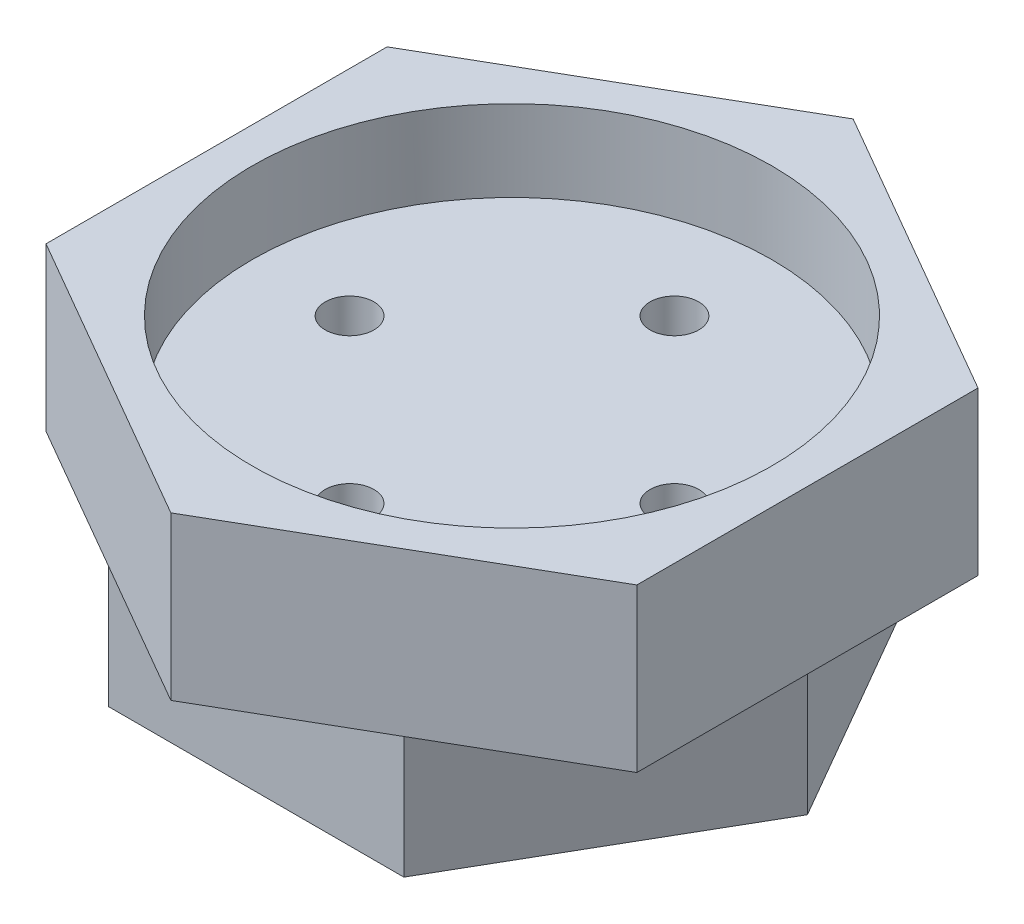
ISO-10303-21;
HEADER;
FILE_DESCRIPTION(('STEP AP214'),'2;1');
FILE_NAME('part.step','',(''),(''),'','','');
FILE_SCHEMA(('AUTOMOTIVE_DESIGN { 1 0 10303 214 1 1 1 1 }'));
ENDSEC;
DATA;
#1=APPLICATION_CONTEXT('core data for automotive mechanical design processes');
#2=APPLICATION_PROTOCOL_DEFINITION('international standard','automotive_design',2000,#1);
#3=PRODUCT_CONTEXT('',#1,'mechanical');
#4=PRODUCT('Part','Part','',(#3));
#5=PRODUCT_RELATED_PRODUCT_CATEGORY('part','',(#4));
#6=PRODUCT_DEFINITION_FORMATION('','',#4);
#7=PRODUCT_DEFINITION_CONTEXT('part definition',#1,'design');
#8=PRODUCT_DEFINITION('design','',#6,#7);
#9=PRODUCT_DEFINITION_SHAPE('','',#8);
#10=(LENGTH_UNIT() NAMED_UNIT(*) SI_UNIT(.MILLI.,.METRE.));
#11=(NAMED_UNIT(*) PLANE_ANGLE_UNIT() SI_UNIT($,.RADIAN.));
#12=(NAMED_UNIT(*) SI_UNIT($,.STERADIAN.) SOLID_ANGLE_UNIT());
#13=UNCERTAINTY_MEASURE_WITH_UNIT(LENGTH_MEASURE(1.E-05),#10,'distance_accuracy_value','');
#14=(GEOMETRIC_REPRESENTATION_CONTEXT(3) GLOBAL_UNCERTAINTY_ASSIGNED_CONTEXT((#13)) GLOBAL_UNIT_ASSIGNED_CONTEXT((#10,
#11,#12)) REPRESENTATION_CONTEXT('',''));
#15=CARTESIAN_POINT('',(0.,0.,0.));
#16=DIRECTION('',(0.,0.,1.));
#17=DIRECTION('',(1.,0.,0.));
#18=AXIS2_PLACEMENT_3D('',#15,#16,#17);
#19=CARTESIAN_POINT('',(0.,0.,0.));
#20=DIRECTION('',(0.,1.,0.));
#21=DIRECTION('',(0.,0.,1.));
#22=AXIS2_PLACEMENT_3D('',#19,#20,#21);
#23=PLANE('',#22);
#24=DIRECTION('',(0.5,0.,0.866025403784439));
#25=VECTOR('',#24,1.);
#26=CARTESIAN_POINT('',(18.1865334794732,0.,-31.5));
#27=LINE('',#26,#25);
#28=CARTESIAN_POINT('',(18.1865334794732,0.,-31.5));
#29=VERTEX_POINT('',#28);
#30=CARTESIAN_POINT('',(36.3730669589464,0.,0.));
#31=VERTEX_POINT('',#30);
#32=EDGE_CURVE('E159',#29,#31,#27,.T.);
#33=ORIENTED_EDGE('',*,*,#32,.F.);
#34=DIRECTION('',(0.866025403784439,0.,0.5));
#35=VECTOR('',#34,1.);
#36=CARTESIAN_POINT('',(0.,0.,-42.));
#37=LINE('',#36,#35);
#38=CARTESIAN_POINT('',(36.3730669589464,0.,-21.));
#39=VERTEX_POINT('',#38);
#40=EDGE_CURVE('E160',#29,#39,#37,.T.);
#41=ORIENTED_EDGE('',*,*,#40,.T.);
#42=DIRECTION('',(0.,0.,1.));
#43=VECTOR('',#42,1.);
#44=CARTESIAN_POINT('',(36.3730669589464,0.,-21.));
#45=LINE('',#44,#43);
#46=EDGE_CURVE('E188',#39,#31,#45,.T.);
#47=ORIENTED_EDGE('',*,*,#46,.T.);
#48=EDGE_LOOP('',(#33,#41,#47));
#49=FACE_BOUND('',#48,.T.);
#50=ADVANCED_FACE('F46',(#49),#23,.F.);
#51=DIRECTION('',(1.,0.,0.));
#52=VECTOR('',#51,1.);
#53=CARTESIAN_POINT('',(-18.1865334794732,0.,-31.5));
#54=LINE('',#53,#52);
#55=CARTESIAN_POINT('',(-18.1865334794731,0.,-31.5));
#56=VERTEX_POINT('',#55);
#57=EDGE_CURVE('E60',#56,#29,#54,.T.);
#58=ORIENTED_EDGE('',*,*,#57,.F.);
#59=DIRECTION('',(0.866025403784439,0.,-0.5));
#60=VECTOR('',#59,1.);
#61=CARTESIAN_POINT('',(-36.3730669589464,0.,-21.));
#62=LINE('',#61,#60);
#63=CARTESIAN_POINT('',(0.,0.,-42.));
#64=VERTEX_POINT('',#63);
#65=EDGE_CURVE('E202',#56,#64,#62,.T.);
#66=ORIENTED_EDGE('',*,*,#65,.T.);
#67=EDGE_CURVE('E162',#64,#29,#37,.T.);
#68=ORIENTED_EDGE('',*,*,#67,.T.);
#69=EDGE_LOOP('',(#58,#66,#68));
#70=FACE_BOUND('',#69,.T.);
#71=ADVANCED_FACE('F244',(#70),#23,.F.);
#72=DIRECTION('',(0.5,0.,-0.866025403784439));
#73=VECTOR('',#72,1.);
#74=CARTESIAN_POINT('',(-36.3730669589464,0.,0.));
#75=LINE('',#74,#73);
#76=CARTESIAN_POINT('',(-36.3730669589464,0.,0.));
#77=VERTEX_POINT('',#76);
#78=EDGE_CURVE('E68',#77,#56,#75,.T.);
#79=ORIENTED_EDGE('',*,*,#78,.F.);
#80=DIRECTION('',(0.,0.,-1.));
#81=VECTOR('',#80,1.);
#82=CARTESIAN_POINT('',(-36.3730669589464,0.,21.));
#83=LINE('',#82,#81);
#84=CARTESIAN_POINT('',(-36.3730669589464,0.,-21.));
#85=VERTEX_POINT('',#84);
#86=EDGE_CURVE('E198',#77,#85,#83,.T.);
#87=ORIENTED_EDGE('',*,*,#86,.T.);
#88=EDGE_CURVE('E171',#85,#56,#62,.T.);
#89=ORIENTED_EDGE('',*,*,#88,.T.);
#90=EDGE_LOOP('',(#79,#87,#89));
#91=FACE_BOUND('',#90,.T.);
#92=ADVANCED_FACE('F250',(#91),#23,.F.);
#93=DIRECTION('',(-0.5,0.,-0.866025403784438));
#94=VECTOR('',#93,1.);
#95=CARTESIAN_POINT('',(-18.1865334794732,0.,31.5));
#96=LINE('',#95,#94);
#97=CARTESIAN_POINT('',(-18.1865334794733,0.,31.5));
#98=VERTEX_POINT('',#97);
#99=EDGE_CURVE('E285',#98,#77,#96,.T.);
#100=ORIENTED_EDGE('',*,*,#99,.F.);
#101=DIRECTION('',(-0.866025403784439,0.,-0.5));
#102=VECTOR('',#101,1.);
#103=CARTESIAN_POINT('',(0.,0.,42.));
#104=LINE('',#103,#102);
#105=CARTESIAN_POINT('',(-36.3730669589464,0.,21.));
#106=VERTEX_POINT('',#105);
#107=EDGE_CURVE('E194',#98,#106,#104,.T.);
#108=ORIENTED_EDGE('',*,*,#107,.T.);
#109=EDGE_CURVE('E199',#106,#77,#83,.T.);
#110=ORIENTED_EDGE('',*,*,#109,.T.);
#111=EDGE_LOOP('',(#100,#108,#110));
#112=FACE_BOUND('',#111,.T.);
#113=ADVANCED_FACE('F257',(#112),#23,.F.);
#114=DIRECTION('',(-1.,0.,0.));
#115=VECTOR('',#114,1.);
#116=CARTESIAN_POINT('',(18.1865334794732,0.,31.5));
#117=LINE('',#116,#115);
#118=CARTESIAN_POINT('',(18.1865334794732,0.,31.5));
#119=VERTEX_POINT('',#118);
#120=EDGE_CURVE('E263',#119,#98,#117,.T.);
#121=ORIENTED_EDGE('',*,*,#120,.F.);
#122=DIRECTION('',(-0.866025403784439,0.,0.5));
#123=VECTOR('',#122,1.);
#124=CARTESIAN_POINT('',(36.3730669589464,0.,21.));
#125=LINE('',#124,#123);
#126=CARTESIAN_POINT('',(0.,0.,42.));
#127=VERTEX_POINT('',#126);
#128=EDGE_CURVE('E191',#119,#127,#125,.T.);
#129=ORIENTED_EDGE('',*,*,#128,.T.);
#130=EDGE_CURVE('E195',#127,#98,#104,.T.);
#131=ORIENTED_EDGE('',*,*,#130,.T.);
#132=EDGE_LOOP('',(#121,#129,#131));
#133=FACE_BOUND('',#132,.T.);
#134=ADVANCED_FACE('F252',(#133),#23,.F.);
#135=DIRECTION('',(-0.5,0.,0.866025403784439));
#136=VECTOR('',#135,1.);
#137=CARTESIAN_POINT('',(36.3730669589464,0.,0.));
#138=LINE('',#137,#136);
#139=EDGE_CURVE('E259',#31,#119,#138,.T.);
#140=ORIENTED_EDGE('',*,*,#139,.F.);
#141=CARTESIAN_POINT('',(36.3730669589464,0.,21.));
#142=VERTEX_POINT('',#141);
#143=EDGE_CURVE('E187',#31,#142,#45,.T.);
#144=ORIENTED_EDGE('',*,*,#143,.T.);
#145=EDGE_CURVE('E192',#142,#119,#125,.T.);
#146=ORIENTED_EDGE('',*,*,#145,.T.);
#147=EDGE_LOOP('',(#140,#144,#146));
#148=FACE_BOUND('',#147,.T.);
#149=ADVANCED_FACE('F246',(#148),#23,.F.);
#150=CARTESIAN_POINT('',(0.,20.,0.));
#151=DIRECTION('',(0.,-1.,0.));
#152=DIRECTION('',(0.,0.,-1.));
#153=AXIS2_PLACEMENT_3D('',#150,#151,#152);
#154=PLANE('',#153);
#155=CARTESIAN_POINT('',(0.,20.,0.));
#156=DIRECTION('',(0.,-1.,0.));
#157=DIRECTION('',(0.,0.,-1.));
#158=AXIS2_PLACEMENT_3D('',#155,#156,#157);
#159=CIRCLE('',#158,32.);
#160=CARTESIAN_POINT('',(0.,20.,-32.));
#161=VERTEX_POINT('',#160);
#162=EDGE_CURVE('E53',#161,#161,#159,.T.);
#163=ORIENTED_EDGE('',*,*,#162,.T.);
#164=EDGE_LOOP('',(#163));
#165=FACE_BOUND('',#164,.T.);
#166=DIRECTION('',(0.866025403784439,0.,0.5));
#167=VECTOR('',#166,1.);
#168=CARTESIAN_POINT('',(0.,20.,-42.));
#169=LINE('',#168,#167);
#170=CARTESIAN_POINT('',(0.,20.,-42.));
#171=VERTEX_POINT('',#170);
#172=CARTESIAN_POINT('',(36.3730669589464,20.,-21.));
#173=VERTEX_POINT('',#172);
#174=EDGE_CURVE('E168',#171,#173,#169,.T.);
#175=ORIENTED_EDGE('',*,*,#174,.F.);
#176=DIRECTION('',(0.866025403784439,0.,-0.5));
#177=VECTOR('',#176,1.);
#178=CARTESIAN_POINT('',(-36.3730669589464,20.,-21.));
#179=LINE('',#178,#177);
#180=CARTESIAN_POINT('',(-36.3730669589464,20.,-21.));
#181=VERTEX_POINT('',#180);
#182=EDGE_CURVE('E183',#181,#171,#179,.T.);
#183=ORIENTED_EDGE('',*,*,#182,.F.);
#184=DIRECTION('',(0.,0.,-1.));
#185=VECTOR('',#184,1.);
#186=CARTESIAN_POINT('',(-36.3730669589464,20.,21.));
#187=LINE('',#186,#185);
#188=CARTESIAN_POINT('',(-36.3730669589464,20.,21.));
#189=VERTEX_POINT('',#188);
#190=EDGE_CURVE('E180',#189,#181,#187,.T.);
#191=ORIENTED_EDGE('',*,*,#190,.F.);
#192=DIRECTION('',(-0.866025403784439,0.,-0.5));
#193=VECTOR('',#192,1.);
#194=CARTESIAN_POINT('',(0.,20.,42.));
#195=LINE('',#194,#193);
#196=CARTESIAN_POINT('',(0.,20.,42.));
#197=VERTEX_POINT('',#196);
#198=EDGE_CURVE('E177',#197,#189,#195,.T.);
#199=ORIENTED_EDGE('',*,*,#198,.F.);
#200=DIRECTION('',(-0.866025403784439,0.,0.5));
#201=VECTOR('',#200,1.);
#202=CARTESIAN_POINT('',(36.3730669589464,20.,21.));
#203=LINE('',#202,#201);
#204=CARTESIAN_POINT('',(36.3730669589464,20.,21.));
#205=VERTEX_POINT('',#204);
#206=EDGE_CURVE('E174',#205,#197,#203,.T.);
#207=ORIENTED_EDGE('',*,*,#206,.F.);
#208=DIRECTION('',(0.,0.,1.));
#209=VECTOR('',#208,1.);
#210=CARTESIAN_POINT('',(36.3730669589464,20.,-21.));
#211=LINE('',#210,#209);
#212=EDGE_CURVE('E170',#173,#205,#211,.T.);
#213=ORIENTED_EDGE('',*,*,#212,.F.);
#214=EDGE_LOOP('',(#175,#183,#191,#199,#207,#213));
#215=FACE_BOUND('',#214,.T.);
#216=ADVANCED_FACE('F223',(#165,#215),#154,.F.);
#217=CARTESIAN_POINT('',(0.,10.,0.));
#218=DIRECTION('',(0.,1.,0.));
#219=DIRECTION('',(0.,0.,1.));
#220=AXIS2_PLACEMENT_3D('',#217,#218,#219);
#221=PLANE('',#220);
#222=CARTESIAN_POINT('',(0.,10.,20.));
#223=DIRECTION('',(0.,1.,0.));
#224=DIRECTION('',(0.,0.,1.));
#225=AXIS2_PLACEMENT_3D('',#222,#223,#224);
#226=CIRCLE('',#225,3.);
#227=CARTESIAN_POINT('',(0.,10.,23.));
#228=VERTEX_POINT('',#227);
#229=EDGE_CURVE('E311',#228,#228,#226,.T.);
#230=ORIENTED_EDGE('',*,*,#229,.F.);
#231=EDGE_LOOP('',(#230));
#232=FACE_BOUND('',#231,.T.);
#233=CARTESIAN_POINT('',(20.,10.,0.));
#234=DIRECTION('',(0.,1.,0.));
#235=DIRECTION('',(0.,0.,1.));
#236=AXIS2_PLACEMENT_3D('',#233,#234,#235);
#237=CIRCLE('',#236,3.);
#238=CARTESIAN_POINT('',(20.,10.,2.99999999999993));
#239=VERTEX_POINT('',#238);
#240=EDGE_CURVE('E313',#239,#239,#237,.T.);
#241=ORIENTED_EDGE('',*,*,#240,.F.);
#242=EDGE_LOOP('',(#241));
#243=FACE_BOUND('',#242,.T.);
#244=CARTESIAN_POINT('',(-1.39659253553725E-13,10.,-20.));
#245=DIRECTION('',(0.,1.,0.));
#246=DIRECTION('',(0.,0.,1.));
#247=AXIS2_PLACEMENT_3D('',#244,#245,#246);
#248=CIRCLE('',#247,3.);
#249=CARTESIAN_POINT('',(-1.39659253553725E-13,10.,-17.));
#250=VERTEX_POINT('',#249);
#251=EDGE_CURVE('E318',#250,#250,#248,.T.);
#252=ORIENTED_EDGE('',*,*,#251,.F.);
#253=EDGE_LOOP('',(#252));
#254=FACE_BOUND('',#253,.T.);
#255=CARTESIAN_POINT('',(-20.,10.,2.09488880330588E-13));
#256=DIRECTION('',(0.,1.,0.));
#257=DIRECTION('',(0.,0.,1.));
#258=AXIS2_PLACEMENT_3D('',#255,#256,#257);
#259=CIRCLE('',#258,3.);
#260=CARTESIAN_POINT('',(-20.,10.,3.00000000000021));
#261=VERTEX_POINT('',#260);
#262=EDGE_CURVE('E323',#261,#261,#259,.T.);
#263=ORIENTED_EDGE('',*,*,#262,.F.);
#264=EDGE_LOOP('',(#263));
#265=FACE_BOUND('',#264,.T.);
#266=CARTESIAN_POINT('',(0.,10.,0.));
#267=DIRECTION('',(0.,1.,0.));
#268=DIRECTION('',(0.,0.,1.));
#269=AXIS2_PLACEMENT_3D('',#266,#267,#268);
#270=CIRCLE('',#269,32.);
#271=CARTESIAN_POINT('',(0.,10.,32.));
#272=VERTEX_POINT('',#271);
#273=EDGE_CURVE('E13',#272,#272,#270,.T.);
#274=ORIENTED_EDGE('',*,*,#273,.T.);
#275=EDGE_LOOP('',(#274));
#276=FACE_BOUND('',#275,.T.);
#277=ADVANCED_FACE('F229',(#232,#243,#254,#265,#276),#221,.T.);
#278=CARTESIAN_POINT('',(0.,20.,0.));
#279=DIRECTION('',(0.,-1.,0.));
#280=DIRECTION('',(0.,0.,-1.));
#281=AXIS2_PLACEMENT_3D('',#278,#279,#280);
#282=CYLINDRICAL_SURFACE('',#281,32.);
#283=ORIENTED_EDGE('',*,*,#273,.F.);
#284=EDGE_LOOP('',(#283));
#285=FACE_BOUND('',#284,.T.);
#286=ORIENTED_EDGE('',*,*,#162,.F.);
#287=EDGE_LOOP('',(#286));
#288=FACE_BOUND('',#287,.T.);
#289=ADVANCED_FACE('F226',(#285,#288),#282,.F.);
#290=CARTESIAN_POINT('',(0.,20.,-42.));
#291=DIRECTION('',(0.5,0.,-0.866025403784439));
#292=DIRECTION('',(-0.866025403784439,0.,-0.5));
#293=AXIS2_PLACEMENT_3D('',#290,#291,#292);
#294=PLANE('',#293);
#295=ORIENTED_EDGE('',*,*,#67,.F.);
#296=DIRECTION('',(0.,-1.,0.));
#297=VECTOR('',#296,1.);
#298=CARTESIAN_POINT('',(0.,20.,-42.));
#299=LINE('',#298,#297);
#300=EDGE_CURVE('E204',#171,#64,#299,.T.);
#301=ORIENTED_EDGE('',*,*,#300,.F.);
#302=ORIENTED_EDGE('',*,*,#174,.T.);
#303=DIRECTION('',(0.,-1.,0.));
#304=VECTOR('',#303,1.);
#305=CARTESIAN_POINT('',(36.3730669589464,20.,-21.));
#306=LINE('',#305,#304);
#307=EDGE_CURVE('E185',#173,#39,#306,.T.);
#308=ORIENTED_EDGE('',*,*,#307,.T.);
#309=ORIENTED_EDGE('',*,*,#40,.F.);
#310=EDGE_LOOP('',(#295,#301,#302,#308,#309));
#311=FACE_BOUND('',#310,.T.);
#312=ADVANCED_FACE('F228',(#311),#294,.T.);
#313=CARTESIAN_POINT('',(-36.3730669589464,20.,-21.));
#314=DIRECTION('',(-0.5,0.,-0.866025403784439));
#315=DIRECTION('',(-0.866025403784439,0.,0.5));
#316=AXIS2_PLACEMENT_3D('',#313,#314,#315);
#317=PLANE('',#316);
#318=ORIENTED_EDGE('',*,*,#88,.F.);
#319=DIRECTION('',(0.,-1.,0.));
#320=VECTOR('',#319,1.);
#321=CARTESIAN_POINT('',(-36.3730669589464,20.,-21.));
#322=LINE('',#321,#320);
#323=EDGE_CURVE('E207',#181,#85,#322,.T.);
#324=ORIENTED_EDGE('',*,*,#323,.F.);
#325=ORIENTED_EDGE('',*,*,#182,.T.);
#326=ORIENTED_EDGE('',*,*,#300,.T.);
#327=ORIENTED_EDGE('',*,*,#65,.F.);
#328=EDGE_LOOP('',(#318,#324,#325,#326,#327));
#329=FACE_BOUND('',#328,.T.);
#330=ADVANCED_FACE('F236',(#329),#317,.T.);
#331=CARTESIAN_POINT('',(-36.3730669589464,20.,21.));
#332=DIRECTION('',(-1.,0.,0.));
#333=DIRECTION('',(0.,0.,1.));
#334=AXIS2_PLACEMENT_3D('',#331,#332,#333);
#335=PLANE('',#334);
#336=ORIENTED_EDGE('',*,*,#109,.F.);
#337=DIRECTION('',(0.,-1.,0.));
#338=VECTOR('',#337,1.);
#339=CARTESIAN_POINT('',(-36.3730669589464,20.,21.));
#340=LINE('',#339,#338);
#341=EDGE_CURVE('E210',#189,#106,#340,.T.);
#342=ORIENTED_EDGE('',*,*,#341,.F.);
#343=ORIENTED_EDGE('',*,*,#190,.T.);
#344=ORIENTED_EDGE('',*,*,#323,.T.);
#345=ORIENTED_EDGE('',*,*,#86,.F.);
#346=EDGE_LOOP('',(#336,#342,#343,#344,#345));
#347=FACE_BOUND('',#346,.T.);
#348=ADVANCED_FACE('F381',(#347),#335,.T.);
#349=CARTESIAN_POINT('',(0.,20.,42.));
#350=DIRECTION('',(-0.5,0.,0.866025403784439));
#351=DIRECTION('',(0.866025403784439,0.,0.5));
#352=AXIS2_PLACEMENT_3D('',#349,#350,#351);
#353=PLANE('',#352);
#354=ORIENTED_EDGE('',*,*,#130,.F.);
#355=DIRECTION('',(0.,-1.,0.));
#356=VECTOR('',#355,1.);
#357=CARTESIAN_POINT('',(0.,20.,42.));
#358=LINE('',#357,#356);
#359=EDGE_CURVE('E213',#197,#127,#358,.T.);
#360=ORIENTED_EDGE('',*,*,#359,.F.);
#361=ORIENTED_EDGE('',*,*,#198,.T.);
#362=ORIENTED_EDGE('',*,*,#341,.T.);
#363=ORIENTED_EDGE('',*,*,#107,.F.);
#364=EDGE_LOOP('',(#354,#360,#361,#362,#363));
#365=FACE_BOUND('',#364,.T.);
#366=ADVANCED_FACE('F385',(#365),#353,.T.);
#367=CARTESIAN_POINT('',(36.3730669589464,20.,21.));
#368=DIRECTION('',(0.5,0.,0.866025403784439));
#369=DIRECTION('',(0.866025403784439,0.,-0.5));
#370=AXIS2_PLACEMENT_3D('',#367,#368,#369);
#371=PLANE('',#370);
#372=ORIENTED_EDGE('',*,*,#145,.F.);
#373=DIRECTION('',(0.,-1.,0.));
#374=VECTOR('',#373,1.);
#375=CARTESIAN_POINT('',(36.3730669589464,20.,21.));
#376=LINE('',#375,#374);
#377=EDGE_CURVE('E216',#205,#142,#376,.T.);
#378=ORIENTED_EDGE('',*,*,#377,.F.);
#379=ORIENTED_EDGE('',*,*,#206,.T.);
#380=ORIENTED_EDGE('',*,*,#359,.T.);
#381=ORIENTED_EDGE('',*,*,#128,.F.);
#382=EDGE_LOOP('',(#372,#378,#379,#380,#381));
#383=FACE_BOUND('',#382,.T.);
#384=ADVANCED_FACE('F278',(#383),#371,.T.);
#385=CARTESIAN_POINT('',(36.3730669589464,20.,-21.));
#386=DIRECTION('',(1.,0.,0.));
#387=DIRECTION('',(0.,0.,-1.));
#388=AXIS2_PLACEMENT_3D('',#385,#386,#387);
#389=PLANE('',#388);
#390=ORIENTED_EDGE('',*,*,#46,.F.);
#391=ORIENTED_EDGE('',*,*,#307,.F.);
#392=ORIENTED_EDGE('',*,*,#212,.T.);
#393=ORIENTED_EDGE('',*,*,#377,.T.);
#394=ORIENTED_EDGE('',*,*,#143,.F.);
#395=EDGE_LOOP('',(#390,#391,#392,#393,#394));
#396=FACE_BOUND('',#395,.T.);
#397=ADVANCED_FACE('F267',(#396),#389,.T.);
#398=CARTESIAN_POINT('',(18.1865334794732,-15.,-31.5));
#399=DIRECTION('',(-0.866025403784438,0.,0.5));
#400=DIRECTION('',(0.5,0.,0.866025403784439));
#401=AXIS2_PLACEMENT_3D('',#398,#399,#400);
#402=PLANE('',#401);
#403=ORIENTED_EDGE('',*,*,#32,.T.);
#404=DIRECTION('',(0.,1.,0.));
#405=VECTOR('',#404,1.);
#406=CARTESIAN_POINT('',(36.3730669589464,-15.,0.));
#407=LINE('',#406,#405);
#408=CARTESIAN_POINT('',(36.3730669589464,-15.,0.));
#409=VERTEX_POINT('',#408);
#410=EDGE_CURVE('E141',#409,#31,#407,.T.);
#411=ORIENTED_EDGE('',*,*,#410,.F.);
#412=DIRECTION('',(0.5,0.,0.866025403784439));
#413=VECTOR('',#412,1.);
#414=CARTESIAN_POINT('',(18.1865334794732,-15.,-31.5));
#415=LINE('',#414,#413);
#416=CARTESIAN_POINT('',(18.1865334794732,-15.,-31.5));
#417=VERTEX_POINT('',#416);
#418=EDGE_CURVE('E148',#417,#409,#415,.T.);
#419=ORIENTED_EDGE('',*,*,#418,.F.);
#420=DIRECTION('',(0.,1.,0.));
#421=VECTOR('',#420,1.);
#422=CARTESIAN_POINT('',(18.1865334794732,-15.,-31.5));
#423=LINE('',#422,#421);
#424=EDGE_CURVE('E293',#417,#29,#423,.T.);
#425=ORIENTED_EDGE('',*,*,#424,.T.);
#426=EDGE_LOOP('',(#403,#411,#419,#425));
#427=FACE_BOUND('',#426,.T.);
#428=ADVANCED_FACE('F158',(#427),#402,.F.);
#429=CARTESIAN_POINT('',(36.3730669589464,-15.,0.));
#430=DIRECTION('',(-0.866025403784439,0.,-0.5));
#431=DIRECTION('',(-0.5,0.,0.866025403784439));
#432=AXIS2_PLACEMENT_3D('',#429,#430,#431);
#433=PLANE('',#432);
#434=ORIENTED_EDGE('',*,*,#139,.T.);
#435=DIRECTION('',(0.,1.,0.));
#436=VECTOR('',#435,1.);
#437=CARTESIAN_POINT('',(18.1865334794732,-15.,31.5));
#438=LINE('',#437,#436);
#439=CARTESIAN_POINT('',(18.1865334794732,-15.,31.5));
#440=VERTEX_POINT('',#439);
#441=EDGE_CURVE('E144',#440,#119,#438,.T.);
#442=ORIENTED_EDGE('',*,*,#441,.F.);
#443=DIRECTION('',(-0.5,0.,0.866025403784439));
#444=VECTOR('',#443,1.);
#445=CARTESIAN_POINT('',(36.3730669589464,-15.,0.));
#446=LINE('',#445,#444);
#447=EDGE_CURVE('E136',#409,#440,#446,.T.);
#448=ORIENTED_EDGE('',*,*,#447,.F.);
#449=ORIENTED_EDGE('',*,*,#410,.T.);
#450=EDGE_LOOP('',(#434,#442,#448,#449));
#451=FACE_BOUND('',#450,.T.);
#452=ADVANCED_FACE('F139',(#451),#433,.F.);
#453=CARTESIAN_POINT('',(18.1865334794732,-15.,31.5));
#454=DIRECTION('',(0.,0.,-1.));
#455=DIRECTION('',(-1.,0.,0.));
#456=AXIS2_PLACEMENT_3D('',#453,#454,#455);
#457=PLANE('',#456);
#458=ORIENTED_EDGE('',*,*,#120,.T.);
#459=DIRECTION('',(0.,1.,0.));
#460=VECTOR('',#459,1.);
#461=CARTESIAN_POINT('',(-18.1865334794732,-15.,31.5));
#462=LINE('',#461,#460);
#463=CARTESIAN_POINT('',(-18.1865334794732,-15.,31.5));
#464=VERTEX_POINT('',#463);
#465=EDGE_CURVE('E164',#464,#98,#462,.T.);
#466=ORIENTED_EDGE('',*,*,#465,.F.);
#467=DIRECTION('',(-1.,0.,0.));
#468=VECTOR('',#467,1.);
#469=CARTESIAN_POINT('',(18.1865334794732,-15.,31.5));
#470=LINE('',#469,#468);
#471=EDGE_CURVE('E147',#440,#464,#470,.T.);
#472=ORIENTED_EDGE('',*,*,#471,.F.);
#473=ORIENTED_EDGE('',*,*,#441,.T.);
#474=EDGE_LOOP('',(#458,#466,#472,#473));
#475=FACE_BOUND('',#474,.T.);
#476=ADVANCED_FACE('F305',(#475),#457,.F.);
#477=CARTESIAN_POINT('',(-18.1865334794732,-15.,31.5));
#478=DIRECTION('',(0.866025403784438,0.,-0.5));
#479=DIRECTION('',(-0.5,0.,-0.866025403784439));
#480=AXIS2_PLACEMENT_3D('',#477,#478,#479);
#481=PLANE('',#480);
#482=ORIENTED_EDGE('',*,*,#99,.T.);
#483=DIRECTION('',(0.,1.,0.));
#484=VECTOR('',#483,1.);
#485=CARTESIAN_POINT('',(-36.3730669589464,-15.,0.));
#486=LINE('',#485,#484);
#487=CARTESIAN_POINT('',(-36.3730669589464,-15.,0.));
#488=VERTEX_POINT('',#487);
#489=EDGE_CURVE('E298',#488,#77,#486,.T.);
#490=ORIENTED_EDGE('',*,*,#489,.F.);
#491=DIRECTION('',(-0.5,0.,-0.866025403784438));
#492=VECTOR('',#491,1.);
#493=CARTESIAN_POINT('',(-18.1865334794732,-15.,31.5));
#494=LINE('',#493,#492);
#495=EDGE_CURVE('E304',#464,#488,#494,.T.);
#496=ORIENTED_EDGE('',*,*,#495,.F.);
#497=ORIENTED_EDGE('',*,*,#465,.T.);
#498=EDGE_LOOP('',(#482,#490,#496,#497));
#499=FACE_BOUND('',#498,.T.);
#500=ADVANCED_FACE('F302',(#499),#481,.F.);
#501=CARTESIAN_POINT('',(-36.3730669589464,-15.,0.));
#502=DIRECTION('',(0.866025403784439,0.,0.5));
#503=DIRECTION('',(0.5,0.,-0.866025403784439));
#504=AXIS2_PLACEMENT_3D('',#501,#502,#503);
#505=PLANE('',#504);
#506=ORIENTED_EDGE('',*,*,#78,.T.);
#507=DIRECTION('',(0.,1.,0.));
#508=VECTOR('',#507,1.);
#509=CARTESIAN_POINT('',(-18.1865334794732,-15.,-31.5));
#510=LINE('',#509,#508);
#511=CARTESIAN_POINT('',(-18.1865334794732,-15.,-31.5));
#512=VERTEX_POINT('',#511);
#513=EDGE_CURVE('E295',#512,#56,#510,.T.);
#514=ORIENTED_EDGE('',*,*,#513,.F.);
#515=DIRECTION('',(0.5,0.,-0.866025403784439));
#516=VECTOR('',#515,1.);
#517=CARTESIAN_POINT('',(-36.3730669589464,-15.,0.));
#518=LINE('',#517,#516);
#519=EDGE_CURVE('E307',#488,#512,#518,.T.);
#520=ORIENTED_EDGE('',*,*,#519,.F.);
#521=ORIENTED_EDGE('',*,*,#489,.T.);
#522=EDGE_LOOP('',(#506,#514,#520,#521));
#523=FACE_BOUND('',#522,.T.);
#524=ADVANCED_FACE('F366',(#523),#505,.F.);
#525=CARTESIAN_POINT('',(-18.1865334794732,-15.,-31.5));
#526=DIRECTION('',(0.,0.,1.));
#527=DIRECTION('',(1.,0.,0.));
#528=AXIS2_PLACEMENT_3D('',#525,#526,#527);
#529=PLANE('',#528);
#530=ORIENTED_EDGE('',*,*,#57,.T.);
#531=ORIENTED_EDGE('',*,*,#424,.F.);
#532=DIRECTION('',(1.,0.,0.));
#533=VECTOR('',#532,1.);
#534=CARTESIAN_POINT('',(-18.1865334794732,-15.,-31.5));
#535=LINE('',#534,#533);
#536=EDGE_CURVE('E153',#512,#417,#535,.T.);
#537=ORIENTED_EDGE('',*,*,#536,.F.);
#538=ORIENTED_EDGE('',*,*,#513,.T.);
#539=EDGE_LOOP('',(#530,#531,#537,#538));
#540=FACE_BOUND('',#539,.T.);
#541=ADVANCED_FACE('F344',(#540),#529,.F.);
#542=CARTESIAN_POINT('',(0.,-15.,0.));
#543=DIRECTION('',(0.,-1.,0.));
#544=DIRECTION('',(0.,0.,-1.));
#545=AXIS2_PLACEMENT_3D('',#542,#543,#544);
#546=PLANE('',#545);
#547=CARTESIAN_POINT('',(0.,-15.,20.));
#548=DIRECTION('',(0.,-1.,0.));
#549=DIRECTION('',(0.,0.,-1.));
#550=AXIS2_PLACEMENT_3D('',#547,#548,#549);
#551=CIRCLE('',#550,3.);
#552=CARTESIAN_POINT('',(0.,-15.,17.));
#553=VERTEX_POINT('',#552);
#554=EDGE_CURVE('E326',#553,#553,#551,.T.);
#555=ORIENTED_EDGE('',*,*,#554,.F.);
#556=EDGE_LOOP('',(#555));
#557=FACE_BOUND('',#556,.T.);
#558=CARTESIAN_POINT('',(20.,-15.,0.));
#559=DIRECTION('',(0.,-1.,0.));
#560=DIRECTION('',(0.,0.,-1.));
#561=AXIS2_PLACEMENT_3D('',#558,#559,#560);
#562=CIRCLE('',#561,3.);
#563=CARTESIAN_POINT('',(20.,-15.,-3.00000000000007));
#564=VERTEX_POINT('',#563);
#565=EDGE_CURVE('E333',#564,#564,#562,.T.);
#566=ORIENTED_EDGE('',*,*,#565,.F.);
#567=EDGE_LOOP('',(#566));
#568=FACE_BOUND('',#567,.T.);
#569=CARTESIAN_POINT('',(-1.39659253553725E-13,-15.,-20.));
#570=DIRECTION('',(0.,-1.,0.));
#571=DIRECTION('',(0.,0.,-1.));
#572=AXIS2_PLACEMENT_3D('',#569,#570,#571);
#573=CIRCLE('',#572,3.);
#574=CARTESIAN_POINT('',(-1.39659253553725E-13,-15.,-23.));
#575=VERTEX_POINT('',#574);
#576=EDGE_CURVE('E330',#575,#575,#573,.T.);
#577=ORIENTED_EDGE('',*,*,#576,.F.);
#578=EDGE_LOOP('',(#577));
#579=FACE_BOUND('',#578,.T.);
#580=CARTESIAN_POINT('',(-20.,-15.,2.09488880330588E-13));
#581=DIRECTION('',(0.,-1.,0.));
#582=DIRECTION('',(0.,0.,-1.));
#583=AXIS2_PLACEMENT_3D('',#580,#581,#582);
#584=CIRCLE('',#583,3.);
#585=CARTESIAN_POINT('',(-20.,-15.,-2.99999999999979));
#586=VERTEX_POINT('',#585);
#587=EDGE_CURVE('E327',#586,#586,#584,.T.);
#588=ORIENTED_EDGE('',*,*,#587,.F.);
#589=EDGE_LOOP('',(#588));
#590=FACE_BOUND('',#589,.T.);
#591=ORIENTED_EDGE('',*,*,#418,.T.);
#592=ORIENTED_EDGE('',*,*,#447,.T.);
#593=ORIENTED_EDGE('',*,*,#471,.T.);
#594=ORIENTED_EDGE('',*,*,#495,.T.);
#595=ORIENTED_EDGE('',*,*,#519,.T.);
#596=ORIENTED_EDGE('',*,*,#536,.T.);
#597=EDGE_LOOP('',(#591,#592,#593,#594,#595,#596));
#598=FACE_BOUND('',#597,.T.);
#599=ADVANCED_FACE('F151',(#557,#568,#579,#590,#598),#546,.T.);
#600=CARTESIAN_POINT('',(-20.,20.,2.09488880330588E-13));
#601=DIRECTION('',(0.,-1.,0.));
#602=DIRECTION('',(0.,0.,-1.));
#603=AXIS2_PLACEMENT_3D('',#600,#601,#602);
#604=CYLINDRICAL_SURFACE('',#603,3.);
#605=ORIENTED_EDGE('',*,*,#262,.T.);
#606=EDGE_LOOP('',(#605));
#607=FACE_BOUND('',#606,.T.);
#608=ORIENTED_EDGE('',*,*,#587,.T.);
#609=EDGE_LOOP('',(#608));
#610=FACE_BOUND('',#609,.T.);
#611=ADVANCED_FACE('F343',(#607,#610),#604,.F.);
#612=CARTESIAN_POINT('',(-1.39659253553725E-13,20.,-20.));
#613=DIRECTION('',(0.,-1.,0.));
#614=DIRECTION('',(0.,0.,-1.));
#615=AXIS2_PLACEMENT_3D('',#612,#613,#614);
#616=CYLINDRICAL_SURFACE('',#615,3.);
#617=ORIENTED_EDGE('',*,*,#251,.T.);
#618=EDGE_LOOP('',(#617));
#619=FACE_BOUND('',#618,.T.);
#620=ORIENTED_EDGE('',*,*,#576,.T.);
#621=EDGE_LOOP('',(#620));
#622=FACE_BOUND('',#621,.T.);
#623=ADVANCED_FACE('F353',(#619,#622),#616,.F.);
#624=CARTESIAN_POINT('',(20.,20.,0.));
#625=DIRECTION('',(0.,-1.,0.));
#626=DIRECTION('',(0.,0.,-1.));
#627=AXIS2_PLACEMENT_3D('',#624,#625,#626);
#628=CYLINDRICAL_SURFACE('',#627,3.);
#629=ORIENTED_EDGE('',*,*,#240,.T.);
#630=EDGE_LOOP('',(#629));
#631=FACE_BOUND('',#630,.T.);
#632=ORIENTED_EDGE('',*,*,#565,.T.);
#633=EDGE_LOOP('',(#632));
#634=FACE_BOUND('',#633,.T.);
#635=ADVANCED_FACE('F359',(#631,#634),#628,.F.);
#636=CARTESIAN_POINT('',(0.,20.,20.));
#637=DIRECTION('',(0.,-1.,0.));
#638=DIRECTION('',(0.,0.,-1.));
#639=AXIS2_PLACEMENT_3D('',#636,#637,#638);
#640=CYLINDRICAL_SURFACE('',#639,3.);
#641=ORIENTED_EDGE('',*,*,#229,.T.);
#642=EDGE_LOOP('',(#641));
#643=FACE_BOUND('',#642,.T.);
#644=ORIENTED_EDGE('',*,*,#554,.T.);
#645=EDGE_LOOP('',(#644));
#646=FACE_BOUND('',#645,.T.);
#647=ADVANCED_FACE('F339',(#643,#646),#640,.F.);
#648=CLOSED_SHELL('',(#50,#71,#92,#113,#134,#149,#216,#277,#289,#312,#330,#348,#366,#384,#397,
#428,#452,#476,#500,#524,#541,#599,#611,#623,#635,#647));
#649=MANIFOLD_SOLID_BREP('B2',#648);
#650=ADVANCED_BREP_SHAPE_REPRESENTATION('',(#18,#649),#14);
#651=SHAPE_DEFINITION_REPRESENTATION(#9,#650);
ENDSEC;
END-ISO-10303-21;
